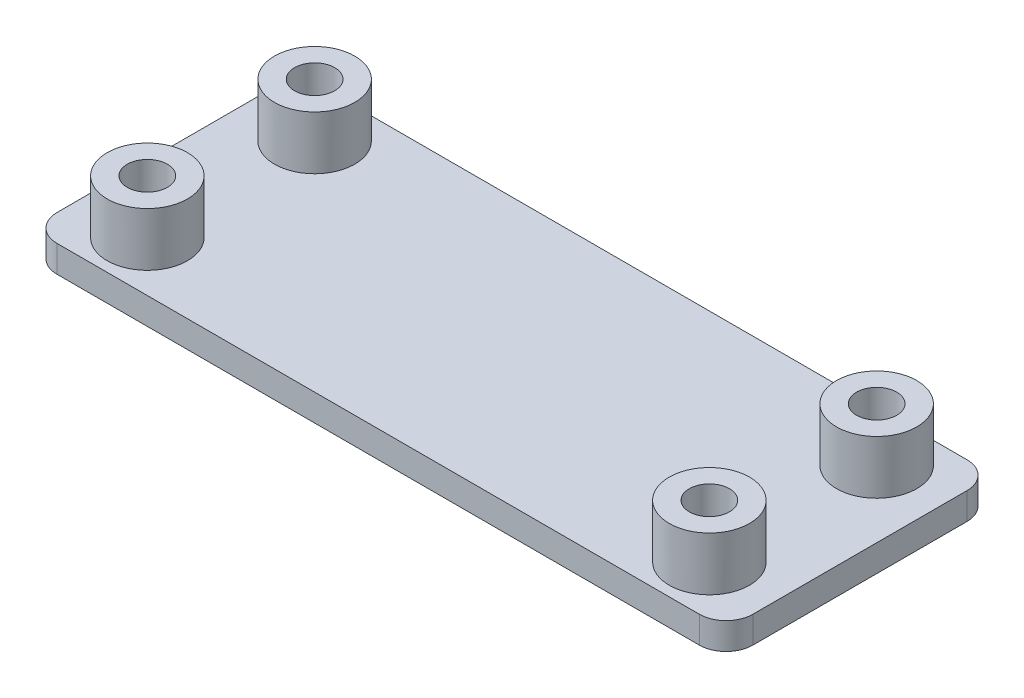
ISO-10303-21;
HEADER;
FILE_DESCRIPTION(('STEP AP214'),'2;1');
FILE_NAME('part.step','',(''),(''),'','','');
FILE_SCHEMA(('AUTOMOTIVE_DESIGN { 1 0 10303 214 1 1 1 1 }'));
ENDSEC;
DATA;
#1=APPLICATION_CONTEXT('core data for automotive mechanical design processes');
#2=APPLICATION_PROTOCOL_DEFINITION('international standard','automotive_design',2000,#1);
#3=PRODUCT_CONTEXT('',#1,'mechanical');
#4=PRODUCT('Part','Part','',(#3));
#5=PRODUCT_RELATED_PRODUCT_CATEGORY('part','',(#4));
#6=PRODUCT_DEFINITION_FORMATION('','',#4);
#7=PRODUCT_DEFINITION_CONTEXT('part definition',#1,'design');
#8=PRODUCT_DEFINITION('design','',#6,#7);
#9=PRODUCT_DEFINITION_SHAPE('','',#8);
#10=(LENGTH_UNIT() NAMED_UNIT(*) SI_UNIT(.MILLI.,.METRE.));
#11=(NAMED_UNIT(*) PLANE_ANGLE_UNIT() SI_UNIT($,.RADIAN.));
#12=(NAMED_UNIT(*) SI_UNIT($,.STERADIAN.) SOLID_ANGLE_UNIT());
#13=UNCERTAINTY_MEASURE_WITH_UNIT(LENGTH_MEASURE(1.E-05),#10,'distance_accuracy_value','');
#14=(GEOMETRIC_REPRESENTATION_CONTEXT(3) GLOBAL_UNCERTAINTY_ASSIGNED_CONTEXT((#13)) GLOBAL_UNIT_ASSIGNED_CONTEXT((#10,
#11,#12)) REPRESENTATION_CONTEXT('',''));
#15=CARTESIAN_POINT('',(0.,0.,0.));
#16=DIRECTION('',(0.,0.,1.));
#17=DIRECTION('',(1.,0.,0.));
#18=AXIS2_PLACEMENT_3D('',#15,#16,#17);
#19=CARTESIAN_POINT('',(0.,2.,0.));
#20=DIRECTION('',(1.,0.,0.));
#21=DIRECTION('',(0.,0.,-1.));
#22=AXIS2_PLACEMENT_3D('',#19,#20,#21);
#23=PLANE('',#22);
#24=DIRECTION('',(0.,0.,1.));
#25=VECTOR('',#24,1.);
#26=CARTESIAN_POINT('',(0.,2.,0.));
#27=LINE('',#26,#25);
#28=CARTESIAN_POINT('',(0.,2.,-18.));
#29=VERTEX_POINT('',#28);
#30=CARTESIAN_POINT('',(0.,2.,-2.));
#31=VERTEX_POINT('',#30);
#32=EDGE_CURVE('E132',#29,#31,#27,.T.);
#33=ORIENTED_EDGE('',*,*,#32,.F.);
#34=DIRECTION('',(0.,-1.,0.));
#35=VECTOR('',#34,1.);
#36=CARTESIAN_POINT('',(0.,2.,-18.));
#37=LINE('',#36,#35);
#38=CARTESIAN_POINT('',(0.,0.,-18.));
#39=VERTEX_POINT('',#38);
#40=EDGE_CURVE('E11',#29,#39,#37,.T.);
#41=ORIENTED_EDGE('',*,*,#40,.T.);
#42=DIRECTION('',(0.,0.,1.));
#43=VECTOR('',#42,1.);
#44=CARTESIAN_POINT('',(0.,0.,0.));
#45=LINE('',#44,#43);
#46=CARTESIAN_POINT('',(0.,0.,-2.));
#47=VERTEX_POINT('',#46);
#48=EDGE_CURVE('E134',#39,#47,#45,.T.);
#49=ORIENTED_EDGE('',*,*,#48,.T.);
#50=DIRECTION('',(0.,-1.,0.));
#51=VECTOR('',#50,1.);
#52=CARTESIAN_POINT('',(0.,2.,-2.));
#53=LINE('',#52,#51);
#54=EDGE_CURVE('E45',#47,#31,#53,.F.);
#55=ORIENTED_EDGE('',*,*,#54,.T.);
#56=EDGE_LOOP('',(#33,#41,#49,#55));
#57=FACE_BOUND('',#56,.T.);
#58=ADVANCED_FACE('F37',(#57),#23,.F.);
#59=CARTESIAN_POINT('',(0.,2.,0.));
#60=DIRECTION('',(0.,0.,-1.));
#61=DIRECTION('',(-1.,0.,0.));
#62=AXIS2_PLACEMENT_3D('',#59,#60,#61);
#63=PLANE('',#62);
#64=DIRECTION('',(1.,0.,0.));
#65=VECTOR('',#64,1.);
#66=CARTESIAN_POINT('',(0.,0.,0.));
#67=LINE('',#66,#65);
#68=CARTESIAN_POINT('',(2.,0.,0.));
#69=VERTEX_POINT('',#68);
#70=CARTESIAN_POINT('',(50.,0.,0.));
#71=VERTEX_POINT('',#70);
#72=EDGE_CURVE('E130',#69,#71,#67,.T.);
#73=ORIENTED_EDGE('',*,*,#72,.T.);
#74=DIRECTION('',(0.,-1.,0.));
#75=VECTOR('',#74,1.);
#76=CARTESIAN_POINT('',(50.,2.,0.));
#77=LINE('',#76,#75);
#78=CARTESIAN_POINT('',(50.,2.,0.));
#79=VERTEX_POINT('',#78);
#80=EDGE_CURVE('E109',#71,#79,#77,.F.);
#81=ORIENTED_EDGE('',*,*,#80,.T.);
#82=DIRECTION('',(1.,0.,0.));
#83=VECTOR('',#82,1.);
#84=CARTESIAN_POINT('',(0.,2.,0.));
#85=LINE('',#84,#83);
#86=CARTESIAN_POINT('',(2.,2.,0.));
#87=VERTEX_POINT('',#86);
#88=EDGE_CURVE('E182',#87,#79,#85,.T.);
#89=ORIENTED_EDGE('',*,*,#88,.F.);
#90=DIRECTION('',(0.,-1.,0.));
#91=VECTOR('',#90,1.);
#92=CARTESIAN_POINT('',(2.,2.,0.));
#93=LINE('',#92,#91);
#94=EDGE_CURVE('E114',#87,#69,#93,.T.);
#95=ORIENTED_EDGE('',*,*,#94,.T.);
#96=EDGE_LOOP('',(#73,#81,#89,#95));
#97=FACE_BOUND('',#96,.T.);
#98=ADVANCED_FACE('F186',(#97),#63,.F.);
#99=CARTESIAN_POINT('',(52.,2.,0.));
#100=DIRECTION('',(-1.,0.,0.));
#101=DIRECTION('',(0.,0.,1.));
#102=AXIS2_PLACEMENT_3D('',#99,#100,#101);
#103=PLANE('',#102);
#104=DIRECTION('',(0.,0.,-1.));
#105=VECTOR('',#104,1.);
#106=CARTESIAN_POINT('',(52.,2.,0.));
#107=LINE('',#106,#105);
#108=CARTESIAN_POINT('',(52.,2.,-2.));
#109=VERTEX_POINT('',#108);
#110=CARTESIAN_POINT('',(52.,2.,-18.));
#111=VERTEX_POINT('',#110);
#112=EDGE_CURVE('E123',#109,#111,#107,.T.);
#113=ORIENTED_EDGE('',*,*,#112,.F.);
#114=DIRECTION('',(0.,-1.,0.));
#115=VECTOR('',#114,1.);
#116=CARTESIAN_POINT('',(52.,2.,-2.));
#117=LINE('',#116,#115);
#118=CARTESIAN_POINT('',(52.,0.,-2.));
#119=VERTEX_POINT('',#118);
#120=EDGE_CURVE('E108',#109,#119,#117,.T.);
#121=ORIENTED_EDGE('',*,*,#120,.T.);
#122=DIRECTION('',(0.,0.,-1.));
#123=VECTOR('',#122,1.);
#124=CARTESIAN_POINT('',(52.,0.,0.));
#125=LINE('',#124,#123);
#126=CARTESIAN_POINT('',(52.,0.,-18.));
#127=VERTEX_POINT('',#126);
#128=EDGE_CURVE('E121',#119,#127,#125,.T.);
#129=ORIENTED_EDGE('',*,*,#128,.T.);
#130=DIRECTION('',(0.,-1.,0.));
#131=VECTOR('',#130,1.);
#132=CARTESIAN_POINT('',(52.,2.,-18.));
#133=LINE('',#132,#131);
#134=EDGE_CURVE('E125',#127,#111,#133,.F.);
#135=ORIENTED_EDGE('',*,*,#134,.T.);
#136=EDGE_LOOP('',(#113,#121,#129,#135));
#137=FACE_BOUND('',#136,.T.);
#138=ADVANCED_FACE('F120',(#137),#103,.F.);
#139=CARTESIAN_POINT('',(0.,2.,-20.));
#140=DIRECTION('',(0.,0.,1.));
#141=DIRECTION('',(1.,0.,0.));
#142=AXIS2_PLACEMENT_3D('',#139,#140,#141);
#143=PLANE('',#142);
#144=DIRECTION('',(-1.,0.,0.));
#145=VECTOR('',#144,1.);
#146=CARTESIAN_POINT('',(0.,2.,-20.));
#147=LINE('',#146,#145);
#148=CARTESIAN_POINT('',(50.,2.,-20.));
#149=VERTEX_POINT('',#148);
#150=CARTESIAN_POINT('',(2.,2.,-20.));
#151=VERTEX_POINT('',#150);
#152=EDGE_CURVE('E142',#149,#151,#147,.T.);
#153=ORIENTED_EDGE('',*,*,#152,.F.);
#154=DIRECTION('',(0.,-1.,0.));
#155=VECTOR('',#154,1.);
#156=CARTESIAN_POINT('',(50.,2.,-20.));
#157=LINE('',#156,#155);
#158=CARTESIAN_POINT('',(50.,0.,-20.));
#159=VERTEX_POINT('',#158);
#160=EDGE_CURVE('E167',#149,#159,#157,.T.);
#161=ORIENTED_EDGE('',*,*,#160,.T.);
#162=DIRECTION('',(-1.,0.,0.));
#163=VECTOR('',#162,1.);
#164=CARTESIAN_POINT('',(0.,0.,-20.));
#165=LINE('',#164,#163);
#166=CARTESIAN_POINT('',(2.,0.,-20.));
#167=VERTEX_POINT('',#166);
#168=EDGE_CURVE('E129',#159,#167,#165,.T.);
#169=ORIENTED_EDGE('',*,*,#168,.T.);
#170=DIRECTION('',(0.,-1.,0.));
#171=VECTOR('',#170,1.);
#172=CARTESIAN_POINT('',(2.,2.,-20.));
#173=LINE('',#172,#171);
#174=EDGE_CURVE('E52',#167,#151,#173,.F.);
#175=ORIENTED_EDGE('',*,*,#174,.T.);
#176=EDGE_LOOP('',(#153,#161,#169,#175));
#177=FACE_BOUND('',#176,.T.);
#178=ADVANCED_FACE('F372',(#177),#143,.F.);
#179=CARTESIAN_POINT('',(0.,2.,0.));
#180=DIRECTION('',(0.,-1.,0.));
#181=DIRECTION('',(0.,0.,-1.));
#182=AXIS2_PLACEMENT_3D('',#179,#180,#181);
#183=PLANE('',#182);
#184=CARTESIAN_POINT('',(47.,2.,-16.25));
#185=DIRECTION('',(0.,-1.,0.));
#186=DIRECTION('',(0.,0.,-1.));
#187=AXIS2_PLACEMENT_3D('',#184,#185,#186);
#188=CIRCLE('',#187,3.);
#189=CARTESIAN_POINT('',(47.,2.,-19.25));
#190=VERTEX_POINT('',#189);
#191=EDGE_CURVE('E148',#190,#190,#188,.F.);
#192=ORIENTED_EDGE('',*,*,#191,.F.);
#193=EDGE_LOOP('',(#192));
#194=FACE_BOUND('',#193,.T.);
#195=CARTESIAN_POINT('',(47.,2.,-3.75));
#196=DIRECTION('',(0.,-1.,0.));
#197=DIRECTION('',(0.,0.,-1.));
#198=AXIS2_PLACEMENT_3D('',#195,#196,#197);
#199=CIRCLE('',#198,3.);
#200=CARTESIAN_POINT('',(47.,2.,-6.75));
#201=VERTEX_POINT('',#200);
#202=EDGE_CURVE('E145',#201,#201,#199,.F.);
#203=ORIENTED_EDGE('',*,*,#202,.F.);
#204=EDGE_LOOP('',(#203));
#205=FACE_BOUND('',#204,.T.);
#206=CARTESIAN_POINT('',(5.,2.,-3.75));
#207=DIRECTION('',(0.,-1.,0.));
#208=DIRECTION('',(0.,0.,-1.));
#209=AXIS2_PLACEMENT_3D('',#206,#207,#208);
#210=CIRCLE('',#209,3.);
#211=CARTESIAN_POINT('',(5.,2.,-6.75));
#212=VERTEX_POINT('',#211);
#213=EDGE_CURVE('E141',#212,#212,#210,.F.);
#214=ORIENTED_EDGE('',*,*,#213,.F.);
#215=EDGE_LOOP('',(#214));
#216=FACE_BOUND('',#215,.T.);
#217=CARTESIAN_POINT('',(5.,2.,-16.25));
#218=DIRECTION('',(0.,-1.,0.));
#219=DIRECTION('',(0.,0.,-1.));
#220=AXIS2_PLACEMENT_3D('',#217,#218,#219);
#221=CIRCLE('',#220,3.);
#222=CARTESIAN_POINT('',(5.,2.,-19.25));
#223=VERTEX_POINT('',#222);
#224=EDGE_CURVE('E138',#223,#223,#221,.F.);
#225=ORIENTED_EDGE('',*,*,#224,.F.);
#226=EDGE_LOOP('',(#225));
#227=FACE_BOUND('',#226,.T.);
#228=ORIENTED_EDGE('',*,*,#88,.T.);
#229=CARTESIAN_POINT('',(50.,2.,-2.));
#230=DIRECTION('',(0.,-1.,0.));
#231=DIRECTION('',(0.,0.,-1.));
#232=AXIS2_PLACEMENT_3D('',#229,#230,#231);
#233=CIRCLE('',#232,2.);
#234=EDGE_CURVE('E164',#79,#109,#233,.F.);
#235=ORIENTED_EDGE('',*,*,#234,.T.);
#236=ORIENTED_EDGE('',*,*,#112,.T.);
#237=CARTESIAN_POINT('',(50.,2.,-18.));
#238=DIRECTION('',(0.,-1.,0.));
#239=DIRECTION('',(0.,0.,-1.));
#240=AXIS2_PLACEMENT_3D('',#237,#238,#239);
#241=CIRCLE('',#240,2.);
#242=EDGE_CURVE('E59',#111,#149,#241,.F.);
#243=ORIENTED_EDGE('',*,*,#242,.T.);
#244=ORIENTED_EDGE('',*,*,#152,.T.);
#245=CARTESIAN_POINT('',(2.,2.,-18.));
#246=DIRECTION('',(0.,-1.,0.));
#247=DIRECTION('',(0.,0.,-1.));
#248=AXIS2_PLACEMENT_3D('',#245,#246,#247);
#249=CIRCLE('',#248,2.);
#250=EDGE_CURVE('E161',#151,#29,#249,.F.);
#251=ORIENTED_EDGE('',*,*,#250,.T.);
#252=ORIENTED_EDGE('',*,*,#32,.T.);
#253=CARTESIAN_POINT('',(2.,2.,-2.));
#254=DIRECTION('',(0.,-1.,0.));
#255=DIRECTION('',(0.,0.,-1.));
#256=AXIS2_PLACEMENT_3D('',#253,#254,#255);
#257=CIRCLE('',#256,2.);
#258=EDGE_CURVE('E159',#31,#87,#257,.F.);
#259=ORIENTED_EDGE('',*,*,#258,.T.);
#260=EDGE_LOOP('',(#228,#235,#236,#243,#244,#251,#252,#259));
#261=FACE_BOUND('',#260,.T.);
#262=ADVANCED_FACE('F179',(#194,#205,#216,#227,#261),#183,.F.);
#263=CARTESIAN_POINT('',(0.,0.,0.));
#264=DIRECTION('',(0.,-1.,0.));
#265=DIRECTION('',(0.,0.,-1.));
#266=AXIS2_PLACEMENT_3D('',#263,#264,#265);
#267=PLANE('',#266);
#268=CARTESIAN_POINT('',(47.,0.,-16.25));
#269=DIRECTION('',(0.,1.,0.));
#270=DIRECTION('',(0.,0.,1.));
#271=AXIS2_PLACEMENT_3D('',#268,#269,#270);
#272=CIRCLE('',#271,1.5);
#273=CARTESIAN_POINT('',(47.,0.,-14.75));
#274=VERTEX_POINT('',#273);
#275=EDGE_CURVE('E218',#274,#274,#272,.T.);
#276=ORIENTED_EDGE('',*,*,#275,.T.);
#277=EDGE_LOOP('',(#276));
#278=FACE_BOUND('',#277,.T.);
#279=CARTESIAN_POINT('',(5.,0.,-3.75));
#280=DIRECTION('',(0.,1.,0.));
#281=DIRECTION('',(0.,0.,1.));
#282=AXIS2_PLACEMENT_3D('',#279,#280,#281);
#283=CIRCLE('',#282,1.5);
#284=CARTESIAN_POINT('',(5.,0.,-2.25));
#285=VERTEX_POINT('',#284);
#286=EDGE_CURVE('E219',#285,#285,#283,.T.);
#287=ORIENTED_EDGE('',*,*,#286,.T.);
#288=EDGE_LOOP('',(#287));
#289=FACE_BOUND('',#288,.T.);
#290=CARTESIAN_POINT('',(5.,0.,-16.25));
#291=DIRECTION('',(0.,1.,0.));
#292=DIRECTION('',(0.,0.,1.));
#293=AXIS2_PLACEMENT_3D('',#290,#291,#292);
#294=CIRCLE('',#293,1.5);
#295=CARTESIAN_POINT('',(5.,0.,-14.75));
#296=VERTEX_POINT('',#295);
#297=EDGE_CURVE('E222',#296,#296,#294,.T.);
#298=ORIENTED_EDGE('',*,*,#297,.T.);
#299=EDGE_LOOP('',(#298));
#300=FACE_BOUND('',#299,.T.);
#301=CARTESIAN_POINT('',(47.,0.,-3.75));
#302=DIRECTION('',(0.,1.,0.));
#303=DIRECTION('',(0.,0.,1.));
#304=AXIS2_PLACEMENT_3D('',#301,#302,#303);
#305=CIRCLE('',#304,1.5);
#306=CARTESIAN_POINT('',(47.,0.,-2.25));
#307=VERTEX_POINT('',#306);
#308=EDGE_CURVE('E215',#307,#307,#305,.T.);
#309=ORIENTED_EDGE('',*,*,#308,.T.);
#310=EDGE_LOOP('',(#309));
#311=FACE_BOUND('',#310,.T.);
#312=ORIENTED_EDGE('',*,*,#128,.F.);
#313=CARTESIAN_POINT('',(50.,0.,-2.));
#314=DIRECTION('',(0.,-1.,0.));
#315=DIRECTION('',(0.,0.,-1.));
#316=AXIS2_PLACEMENT_3D('',#313,#314,#315);
#317=CIRCLE('',#316,2.);
#318=EDGE_CURVE('E104',#119,#71,#317,.T.);
#319=ORIENTED_EDGE('',*,*,#318,.T.);
#320=ORIENTED_EDGE('',*,*,#72,.F.);
#321=CARTESIAN_POINT('',(2.,0.,-2.));
#322=DIRECTION('',(0.,-1.,0.));
#323=DIRECTION('',(0.,0.,-1.));
#324=AXIS2_PLACEMENT_3D('',#321,#322,#323);
#325=CIRCLE('',#324,2.);
#326=EDGE_CURVE('E124',#69,#47,#325,.T.);
#327=ORIENTED_EDGE('',*,*,#326,.T.);
#328=ORIENTED_EDGE('',*,*,#48,.F.);
#329=CARTESIAN_POINT('',(2.,0.,-18.));
#330=DIRECTION('',(0.,-1.,0.));
#331=DIRECTION('',(0.,0.,-1.));
#332=AXIS2_PLACEMENT_3D('',#329,#330,#331);
#333=CIRCLE('',#332,2.);
#334=EDGE_CURVE('E153',#39,#167,#333,.T.);
#335=ORIENTED_EDGE('',*,*,#334,.T.);
#336=ORIENTED_EDGE('',*,*,#168,.F.);
#337=CARTESIAN_POINT('',(50.,0.,-18.));
#338=DIRECTION('',(0.,-1.,0.));
#339=DIRECTION('',(0.,0.,-1.));
#340=AXIS2_PLACEMENT_3D('',#337,#338,#339);
#341=CIRCLE('',#340,2.);
#342=EDGE_CURVE('E115',#159,#127,#341,.T.);
#343=ORIENTED_EDGE('',*,*,#342,.T.);
#344=EDGE_LOOP('',(#312,#319,#320,#327,#328,#335,#336,#343));
#345=FACE_BOUND('',#344,.T.);
#346=ADVANCED_FACE('F127',(#278,#289,#300,#311,#345),#267,.T.);
#347=CARTESIAN_POINT('',(5.,6.,-16.25));
#348=DIRECTION('',(0.,1.,0.));
#349=DIRECTION('',(0.,0.,1.));
#350=AXIS2_PLACEMENT_3D('',#347,#348,#349);
#351=PLANE('',#350);
#352=CARTESIAN_POINT('',(5.,6.,-16.25));
#353=DIRECTION('',(0.,1.,0.));
#354=DIRECTION('',(0.,0.,1.));
#355=AXIS2_PLACEMENT_3D('',#352,#353,#354);
#356=CIRCLE('',#355,3.);
#357=CARTESIAN_POINT('',(5.,6.,-13.25));
#358=VERTEX_POINT('',#357);
#359=EDGE_CURVE('E187',#358,#358,#356,.T.);
#360=ORIENTED_EDGE('',*,*,#359,.T.);
#361=EDGE_LOOP('',(#360));
#362=FACE_BOUND('',#361,.T.);
#363=CARTESIAN_POINT('',(5.,6.,-16.25));
#364=DIRECTION('',(0.,1.,0.));
#365=DIRECTION('',(0.,0.,1.));
#366=AXIS2_PLACEMENT_3D('',#363,#364,#365);
#367=CIRCLE('',#366,1.5);
#368=CARTESIAN_POINT('',(5.,6.,-14.75));
#369=VERTEX_POINT('',#368);
#370=EDGE_CURVE('E189',#369,#369,#367,.T.);
#371=ORIENTED_EDGE('',*,*,#370,.F.);
#372=EDGE_LOOP('',(#371));
#373=FACE_BOUND('',#372,.T.);
#374=ADVANCED_FACE('F245',(#362,#373),#351,.T.);
#375=CARTESIAN_POINT('',(5.,6.,-16.25));
#376=DIRECTION('',(0.,-1.,0.));
#377=DIRECTION('',(0.,0.,-1.));
#378=AXIS2_PLACEMENT_3D('',#375,#376,#377);
#379=CYLINDRICAL_SURFACE('',#378,3.);
#380=ORIENTED_EDGE('',*,*,#359,.F.);
#381=EDGE_LOOP('',(#380));
#382=FACE_BOUND('',#381,.T.);
#383=ORIENTED_EDGE('',*,*,#224,.T.);
#384=EDGE_LOOP('',(#383));
#385=FACE_BOUND('',#384,.T.);
#386=ADVANCED_FACE('F233',(#382,#385),#379,.T.);
#387=CARTESIAN_POINT('',(5.,6.,-16.25));
#388=DIRECTION('',(0.,-1.,0.));
#389=DIRECTION('',(0.,0.,-1.));
#390=AXIS2_PLACEMENT_3D('',#387,#388,#389);
#391=CYLINDRICAL_SURFACE('',#390,1.5);
#392=ORIENTED_EDGE('',*,*,#370,.T.);
#393=EDGE_LOOP('',(#392));
#394=FACE_BOUND('',#393,.T.);
#395=ORIENTED_EDGE('',*,*,#297,.F.);
#396=EDGE_LOOP('',(#395));
#397=FACE_BOUND('',#396,.T.);
#398=ADVANCED_FACE('F230',(#394,#397),#391,.F.);
#399=CARTESIAN_POINT('',(5.,6.,-3.75));
#400=DIRECTION('',(0.,1.,0.));
#401=DIRECTION('',(0.,0.,1.));
#402=AXIS2_PLACEMENT_3D('',#399,#400,#401);
#403=PLANE('',#402);
#404=CARTESIAN_POINT('',(5.,6.,-3.75));
#405=DIRECTION('',(0.,1.,0.));
#406=DIRECTION('',(0.,0.,1.));
#407=AXIS2_PLACEMENT_3D('',#404,#405,#406);
#408=CIRCLE('',#407,3.);
#409=CARTESIAN_POINT('',(5.,6.,-0.749999999999996));
#410=VERTEX_POINT('',#409);
#411=EDGE_CURVE('E197',#410,#410,#408,.T.);
#412=ORIENTED_EDGE('',*,*,#411,.T.);
#413=EDGE_LOOP('',(#412));
#414=FACE_BOUND('',#413,.T.);
#415=CARTESIAN_POINT('',(5.,6.,-3.75));
#416=DIRECTION('',(0.,1.,0.));
#417=DIRECTION('',(0.,0.,1.));
#418=AXIS2_PLACEMENT_3D('',#415,#416,#417);
#419=CIRCLE('',#418,1.5);
#420=CARTESIAN_POINT('',(5.,6.,-2.25));
#421=VERTEX_POINT('',#420);
#422=EDGE_CURVE('E200',#421,#421,#419,.T.);
#423=ORIENTED_EDGE('',*,*,#422,.F.);
#424=EDGE_LOOP('',(#423));
#425=FACE_BOUND('',#424,.T.);
#426=ADVANCED_FACE('F232',(#414,#425),#403,.T.);
#427=CARTESIAN_POINT('',(5.,6.,-3.75));
#428=DIRECTION('',(0.,-1.,0.));
#429=DIRECTION('',(0.,0.,-1.));
#430=AXIS2_PLACEMENT_3D('',#427,#428,#429);
#431=CYLINDRICAL_SURFACE('',#430,3.);
#432=ORIENTED_EDGE('',*,*,#411,.F.);
#433=EDGE_LOOP('',(#432));
#434=FACE_BOUND('',#433,.T.);
#435=ORIENTED_EDGE('',*,*,#213,.T.);
#436=EDGE_LOOP('',(#435));
#437=FACE_BOUND('',#436,.T.);
#438=ADVANCED_FACE('F241',(#434,#437),#431,.T.);
#439=CARTESIAN_POINT('',(5.,6.,-3.75));
#440=DIRECTION('',(0.,-1.,0.));
#441=DIRECTION('',(0.,0.,-1.));
#442=AXIS2_PLACEMENT_3D('',#439,#440,#441);
#443=CYLINDRICAL_SURFACE('',#442,1.5);
#444=ORIENTED_EDGE('',*,*,#422,.T.);
#445=EDGE_LOOP('',(#444));
#446=FACE_BOUND('',#445,.T.);
#447=ORIENTED_EDGE('',*,*,#286,.F.);
#448=EDGE_LOOP('',(#447));
#449=FACE_BOUND('',#448,.T.);
#450=ADVANCED_FACE('F313',(#446,#449),#443,.F.);
#451=CARTESIAN_POINT('',(47.,6.,-3.75));
#452=DIRECTION('',(0.,1.,0.));
#453=DIRECTION('',(0.,0.,1.));
#454=AXIS2_PLACEMENT_3D('',#451,#452,#453);
#455=PLANE('',#454);
#456=CARTESIAN_POINT('',(47.,6.,-3.75));
#457=DIRECTION('',(0.,1.,0.));
#458=DIRECTION('',(0.,0.,1.));
#459=AXIS2_PLACEMENT_3D('',#456,#457,#458);
#460=CIRCLE('',#459,3.);
#461=CARTESIAN_POINT('',(47.,6.,-0.749999999999998));
#462=VERTEX_POINT('',#461);
#463=EDGE_CURVE('E203',#462,#462,#460,.T.);
#464=ORIENTED_EDGE('',*,*,#463,.T.);
#465=EDGE_LOOP('',(#464));
#466=FACE_BOUND('',#465,.T.);
#467=CARTESIAN_POINT('',(47.,6.,-3.75));
#468=DIRECTION('',(0.,1.,0.));
#469=DIRECTION('',(0.,0.,1.));
#470=AXIS2_PLACEMENT_3D('',#467,#468,#469);
#471=CIRCLE('',#470,1.5);
#472=CARTESIAN_POINT('',(47.,6.,-2.25));
#473=VERTEX_POINT('',#472);
#474=EDGE_CURVE('E206',#473,#473,#471,.T.);
#475=ORIENTED_EDGE('',*,*,#474,.F.);
#476=EDGE_LOOP('',(#475));
#477=FACE_BOUND('',#476,.T.);
#478=ADVANCED_FACE('F317',(#466,#477),#455,.T.);
#479=CARTESIAN_POINT('',(47.,6.,-3.75));
#480=DIRECTION('',(0.,-1.,0.));
#481=DIRECTION('',(0.,0.,-1.));
#482=AXIS2_PLACEMENT_3D('',#479,#480,#481);
#483=CYLINDRICAL_SURFACE('',#482,3.);
#484=ORIENTED_EDGE('',*,*,#463,.F.);
#485=EDGE_LOOP('',(#484));
#486=FACE_BOUND('',#485,.T.);
#487=ORIENTED_EDGE('',*,*,#202,.T.);
#488=EDGE_LOOP('',(#487));
#489=FACE_BOUND('',#488,.T.);
#490=ADVANCED_FACE('F305',(#486,#489),#483,.T.);
#491=CARTESIAN_POINT('',(47.,6.,-3.75));
#492=DIRECTION('',(0.,-1.,0.));
#493=DIRECTION('',(0.,0.,-1.));
#494=AXIS2_PLACEMENT_3D('',#491,#492,#493);
#495=CYLINDRICAL_SURFACE('',#494,1.5);
#496=ORIENTED_EDGE('',*,*,#474,.T.);
#497=EDGE_LOOP('',(#496));
#498=FACE_BOUND('',#497,.T.);
#499=ORIENTED_EDGE('',*,*,#308,.F.);
#500=EDGE_LOOP('',(#499));
#501=FACE_BOUND('',#500,.T.);
#502=ADVANCED_FACE('F299',(#498,#501),#495,.F.);
#503=CARTESIAN_POINT('',(47.,6.,-16.25));
#504=DIRECTION('',(0.,1.,0.));
#505=DIRECTION('',(0.,0.,1.));
#506=AXIS2_PLACEMENT_3D('',#503,#504,#505);
#507=PLANE('',#506);
#508=CARTESIAN_POINT('',(47.,6.,-16.25));
#509=DIRECTION('',(0.,1.,0.));
#510=DIRECTION('',(0.,0.,1.));
#511=AXIS2_PLACEMENT_3D('',#508,#509,#510);
#512=CIRCLE('',#511,3.);
#513=CARTESIAN_POINT('',(47.,6.,-13.25));
#514=VERTEX_POINT('',#513);
#515=EDGE_CURVE('E209',#514,#514,#512,.T.);
#516=ORIENTED_EDGE('',*,*,#515,.T.);
#517=EDGE_LOOP('',(#516));
#518=FACE_BOUND('',#517,.T.);
#519=CARTESIAN_POINT('',(47.,6.,-16.25));
#520=DIRECTION('',(0.,1.,0.));
#521=DIRECTION('',(0.,0.,1.));
#522=AXIS2_PLACEMENT_3D('',#519,#520,#521);
#523=CIRCLE('',#522,1.5);
#524=CARTESIAN_POINT('',(47.,6.,-14.75));
#525=VERTEX_POINT('',#524);
#526=EDGE_CURVE('E212',#525,#525,#523,.T.);
#527=ORIENTED_EDGE('',*,*,#526,.F.);
#528=EDGE_LOOP('',(#527));
#529=FACE_BOUND('',#528,.T.);
#530=ADVANCED_FACE('F304',(#518,#529),#507,.T.);
#531=CARTESIAN_POINT('',(47.,6.,-16.25));
#532=DIRECTION('',(0.,-1.,0.));
#533=DIRECTION('',(0.,0.,-1.));
#534=AXIS2_PLACEMENT_3D('',#531,#532,#533);
#535=CYLINDRICAL_SURFACE('',#534,3.);
#536=ORIENTED_EDGE('',*,*,#515,.F.);
#537=EDGE_LOOP('',(#536));
#538=FACE_BOUND('',#537,.T.);
#539=ORIENTED_EDGE('',*,*,#191,.T.);
#540=EDGE_LOOP('',(#539));
#541=FACE_BOUND('',#540,.T.);
#542=ADVANCED_FACE('F291',(#538,#541),#535,.T.);
#543=CARTESIAN_POINT('',(47.,6.,-16.25));
#544=DIRECTION('',(0.,-1.,0.));
#545=DIRECTION('',(0.,0.,-1.));
#546=AXIS2_PLACEMENT_3D('',#543,#544,#545);
#547=CYLINDRICAL_SURFACE('',#546,1.5);
#548=ORIENTED_EDGE('',*,*,#526,.T.);
#549=EDGE_LOOP('',(#548));
#550=FACE_BOUND('',#549,.T.);
#551=ORIENTED_EDGE('',*,*,#275,.F.);
#552=EDGE_LOOP('',(#551));
#553=FACE_BOUND('',#552,.T.);
#554=ADVANCED_FACE('F262',(#550,#553),#547,.F.);
#555=CARTESIAN_POINT('',(50.,2.,-2.));
#556=DIRECTION('',(0.,-1.,0.));
#557=DIRECTION('',(0.,0.,-1.));
#558=AXIS2_PLACEMENT_3D('',#555,#556,#557);
#559=CYLINDRICAL_SURFACE('',#558,2.);
#560=ORIENTED_EDGE('',*,*,#234,.F.);
#561=ORIENTED_EDGE('',*,*,#80,.F.);
#562=ORIENTED_EDGE('',*,*,#318,.F.);
#563=ORIENTED_EDGE('',*,*,#120,.F.);
#564=EDGE_LOOP('',(#560,#561,#562,#563));
#565=FACE_BOUND('',#564,.T.);
#566=ADVANCED_FACE('F107',(#565),#559,.T.);
#567=CARTESIAN_POINT('',(50.,2.,-18.));
#568=DIRECTION('',(0.,-1.,0.));
#569=DIRECTION('',(0.,0.,-1.));
#570=AXIS2_PLACEMENT_3D('',#567,#568,#569);
#571=CYLINDRICAL_SURFACE('',#570,2.);
#572=ORIENTED_EDGE('',*,*,#242,.F.);
#573=ORIENTED_EDGE('',*,*,#134,.F.);
#574=ORIENTED_EDGE('',*,*,#342,.F.);
#575=ORIENTED_EDGE('',*,*,#160,.F.);
#576=EDGE_LOOP('',(#572,#573,#574,#575));
#577=FACE_BOUND('',#576,.T.);
#578=ADVANCED_FACE('F261',(#577),#571,.T.);
#579=CARTESIAN_POINT('',(2.,2.,-18.));
#580=DIRECTION('',(0.,-1.,0.));
#581=DIRECTION('',(0.,0.,-1.));
#582=AXIS2_PLACEMENT_3D('',#579,#580,#581);
#583=CYLINDRICAL_SURFACE('',#582,2.);
#584=ORIENTED_EDGE('',*,*,#250,.F.);
#585=ORIENTED_EDGE('',*,*,#174,.F.);
#586=ORIENTED_EDGE('',*,*,#334,.F.);
#587=ORIENTED_EDGE('',*,*,#40,.F.);
#588=EDGE_LOOP('',(#584,#585,#586,#587));
#589=FACE_BOUND('',#588,.T.);
#590=ADVANCED_FACE('F264',(#589),#583,.T.);
#591=CARTESIAN_POINT('',(2.,2.,-2.));
#592=DIRECTION('',(0.,-1.,0.));
#593=DIRECTION('',(0.,0.,-1.));
#594=AXIS2_PLACEMENT_3D('',#591,#592,#593);
#595=CYLINDRICAL_SURFACE('',#594,2.);
#596=ORIENTED_EDGE('',*,*,#258,.F.);
#597=ORIENTED_EDGE('',*,*,#54,.F.);
#598=ORIENTED_EDGE('',*,*,#326,.F.);
#599=ORIENTED_EDGE('',*,*,#94,.F.);
#600=EDGE_LOOP('',(#596,#597,#598,#599));
#601=FACE_BOUND('',#600,.T.);
#602=ADVANCED_FACE('F39',(#601),#595,.T.);
#603=CLOSED_SHELL('',(#58,#98,#138,#178,#262,#346,#374,#386,#398,#426,#438,#450,#478,#490,#502,
#530,#542,#554,#566,#578,#590,#602));
#604=MANIFOLD_SOLID_BREP('B2',#603);
#605=ADVANCED_BREP_SHAPE_REPRESENTATION('',(#18,#604),#14);
#606=SHAPE_DEFINITION_REPRESENTATION(#9,#605);
ENDSEC;
END-ISO-10303-21;
